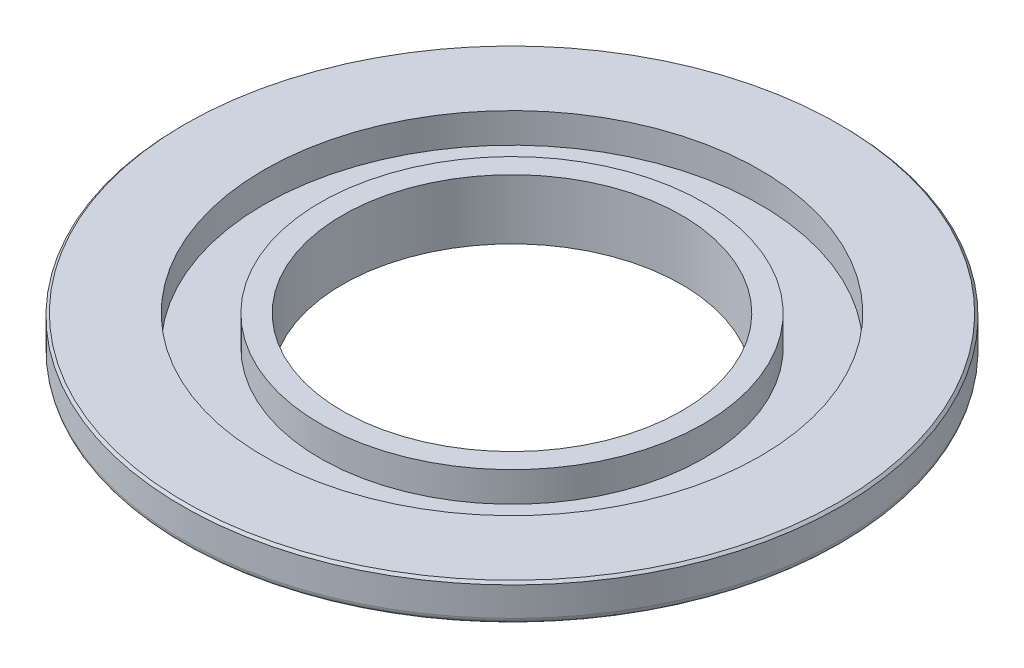
ISO-10303-21;
HEADER;
FILE_DESCRIPTION(('STEP AP214'),'2;1');
FILE_NAME('part.step','',(''),(''),'','','');
FILE_SCHEMA(('AUTOMOTIVE_DESIGN { 1 0 10303 214 1 1 1 1 }'));
ENDSEC;
DATA;
#1=APPLICATION_CONTEXT('core data for automotive mechanical design processes');
#2=APPLICATION_PROTOCOL_DEFINITION('international standard','automotive_design',2000,#1);
#3=PRODUCT_CONTEXT('',#1,'mechanical');
#4=PRODUCT('Part','Part','',(#3));
#5=PRODUCT_RELATED_PRODUCT_CATEGORY('part','',(#4));
#6=PRODUCT_DEFINITION_FORMATION('','',#4);
#7=PRODUCT_DEFINITION_CONTEXT('part definition',#1,'design');
#8=PRODUCT_DEFINITION('design','',#6,#7);
#9=PRODUCT_DEFINITION_SHAPE('','',#8);
#10=(LENGTH_UNIT() NAMED_UNIT(*) SI_UNIT(.MILLI.,.METRE.));
#11=(NAMED_UNIT(*) PLANE_ANGLE_UNIT() SI_UNIT($,.RADIAN.));
#12=(NAMED_UNIT(*) SI_UNIT($,.STERADIAN.) SOLID_ANGLE_UNIT());
#13=UNCERTAINTY_MEASURE_WITH_UNIT(LENGTH_MEASURE(1.E-05),#10,'distance_accuracy_value','');
#14=(GEOMETRIC_REPRESENTATION_CONTEXT(3) GLOBAL_UNCERTAINTY_ASSIGNED_CONTEXT((#13)) GLOBAL_UNIT_ASSIGNED_CONTEXT((#10,
#11,#12)) REPRESENTATION_CONTEXT('',''));
#15=CARTESIAN_POINT('',(0.,0.,0.));
#16=DIRECTION('',(0.,0.,1.));
#17=DIRECTION('',(1.,0.,0.));
#18=AXIS2_PLACEMENT_3D('',#15,#16,#17);
#19=CARTESIAN_POINT('',(0.,0.,0.));
#20=DIRECTION('',(0.,-1.,0.));
#21=DIRECTION('',(0.,0.,-1.));
#22=AXIS2_PLACEMENT_3D('',#19,#20,#21);
#23=PLANE('',#22);
#24=CARTESIAN_POINT('',(0.,0.,0.));
#25=DIRECTION('',(0.,-1.,0.));
#26=DIRECTION('',(1.,0.,0.));
#27=AXIS2_PLACEMENT_3D('',#24,#25,#26);
#28=CIRCLE('',#27,14.15);
#29=CARTESIAN_POINT('',(14.15,0.,0.));
#30=VERTEX_POINT('',#29);
#31=EDGE_CURVE('E11',#30,#30,#28,.T.);
#32=ORIENTED_EDGE('',*,*,#31,.F.);
#33=EDGE_LOOP('',(#32));
#34=FACE_BOUND('',#33,.T.);
#35=CARTESIAN_POINT('',(0.,0.,0.));
#36=DIRECTION('',(0.,1.,0.));
#37=DIRECTION('',(1.,0.,0.));
#38=AXIS2_PLACEMENT_3D('',#35,#36,#37);
#39=CIRCLE('',#38,20.04);
#40=CARTESIAN_POINT('',(-20.04,0.,0.));
#41=VERTEX_POINT('',#40);
#42=EDGE_CURVE('E94',#41,#41,#39,.T.);
#43=ORIENTED_EDGE('',*,*,#42,.F.);
#44=EDGE_LOOP('',(#43));
#45=FACE_BOUND('',#44,.T.);
#46=ADVANCED_FACE('F17',(#34,#45),#23,.T.);
#47=CARTESIAN_POINT('',(0.,5.25,0.));
#48=DIRECTION('',(0.,-1.,0.));
#49=DIRECTION('',(-1.,0.,0.));
#50=AXIS2_PLACEMENT_3D('',#47,#48,#49);
#51=CYLINDRICAL_SURFACE('',#50,14.15);
#52=CARTESIAN_POINT('',(0.,5.,0.));
#53=DIRECTION('',(0.,-1.,0.));
#54=DIRECTION('',(1.,0.,0.));
#55=AXIS2_PLACEMENT_3D('',#52,#53,#54);
#56=CIRCLE('',#55,14.15);
#57=CARTESIAN_POINT('',(14.15,5.,0.));
#58=VERTEX_POINT('',#57);
#59=EDGE_CURVE('E130',#58,#58,#56,.T.);
#60=ORIENTED_EDGE('',*,*,#59,.F.);
#61=DIRECTION('',(0.,-1.,0.));
#62=VECTOR('',#61,1.);
#63=CARTESIAN_POINT('',(14.15,5.25,0.));
#64=LINE('',#63,#62);
#65=EDGE_CURVE('E27',#58,#30,#64,.T.);
#66=ORIENTED_EDGE('',*,*,#65,.T.);
#67=ORIENTED_EDGE('',*,*,#31,.T.);
#68=ORIENTED_EDGE('',*,*,#65,.F.);
#69=EDGE_LOOP('',(#60,#66,#67,#68));
#70=FACE_BOUND('',#69,.T.);
#71=ADVANCED_FACE('F19',(#70),#51,.F.);
#72=CARTESIAN_POINT('',(0.,5.,0.));
#73=DIRECTION('',(0.,-1.,0.));
#74=DIRECTION('',(0.,0.,-1.));
#75=AXIS2_PLACEMENT_3D('',#72,#73,#74);
#76=PLANE('',#75);
#77=ORIENTED_EDGE('',*,*,#59,.T.);
#78=EDGE_LOOP('',(#77));
#79=FACE_BOUND('',#78,.T.);
#80=CARTESIAN_POINT('',(0.,5.,0.));
#81=DIRECTION('',(0.,-1.,0.));
#82=DIRECTION('',(1.,0.,0.));
#83=AXIS2_PLACEMENT_3D('',#80,#81,#82);
#84=CIRCLE('',#83,16.);
#85=CARTESIAN_POINT('',(16.,5.,0.));
#86=VERTEX_POINT('',#85);
#87=EDGE_CURVE('E124',#86,#86,#84,.T.);
#88=ORIENTED_EDGE('',*,*,#87,.F.);
#89=EDGE_LOOP('',(#88));
#90=FACE_BOUND('',#89,.T.);
#91=ADVANCED_FACE('F187',(#79,#90),#76,.F.);
#92=CARTESIAN_POINT('',(0.,5.25,0.));
#93=DIRECTION('',(0.,-1.,0.));
#94=DIRECTION('',(-1.,0.,0.));
#95=AXIS2_PLACEMENT_3D('',#92,#93,#94);
#96=CYLINDRICAL_SURFACE('',#95,16.);
#97=CARTESIAN_POINT('',(0.,2.5,0.));
#98=DIRECTION('',(0.,-1.,0.));
#99=DIRECTION('',(1.,0.,0.));
#100=AXIS2_PLACEMENT_3D('',#97,#98,#99);
#101=CIRCLE('',#100,16.);
#102=CARTESIAN_POINT('',(16.,2.5,0.));
#103=VERTEX_POINT('',#102);
#104=EDGE_CURVE('E125',#103,#103,#101,.T.);
#105=ORIENTED_EDGE('',*,*,#104,.F.);
#106=DIRECTION('',(0.,1.,0.));
#107=VECTOR('',#106,1.);
#108=CARTESIAN_POINT('',(16.,5.25,0.));
#109=LINE('',#108,#107);
#110=EDGE_CURVE('E120',#103,#86,#109,.T.);
#111=ORIENTED_EDGE('',*,*,#110,.T.);
#112=ORIENTED_EDGE('',*,*,#87,.T.);
#113=ORIENTED_EDGE('',*,*,#110,.F.);
#114=EDGE_LOOP('',(#105,#111,#112,#113));
#115=FACE_BOUND('',#114,.T.);
#116=ADVANCED_FACE('F192',(#115),#96,.T.);
#117=CARTESIAN_POINT('',(0.,2.5,0.));
#118=DIRECTION('',(0.,-1.,0.));
#119=DIRECTION('',(0.,0.,-1.));
#120=AXIS2_PLACEMENT_3D('',#117,#118,#119);
#121=PLANE('',#120);
#122=ORIENTED_EDGE('',*,*,#104,.T.);
#123=EDGE_LOOP('',(#122));
#124=FACE_BOUND('',#123,.T.);
#125=CARTESIAN_POINT('',(0.,2.5,0.));
#126=DIRECTION('',(0.,-1.,0.));
#127=DIRECTION('',(1.,0.,0.));
#128=AXIS2_PLACEMENT_3D('',#125,#126,#127);
#129=CIRCLE('',#128,20.7);
#130=CARTESIAN_POINT('',(20.7,2.5,0.));
#131=VERTEX_POINT('',#130);
#132=EDGE_CURVE('E114',#131,#131,#129,.T.);
#133=ORIENTED_EDGE('',*,*,#132,.F.);
#134=EDGE_LOOP('',(#133));
#135=FACE_BOUND('',#134,.T.);
#136=ADVANCED_FACE('F194',(#124,#135),#121,.F.);
#137=CARTESIAN_POINT('',(0.,5.25,0.));
#138=DIRECTION('',(0.,-1.,0.));
#139=DIRECTION('',(-1.,0.,0.));
#140=AXIS2_PLACEMENT_3D('',#137,#138,#139);
#141=CYLINDRICAL_SURFACE('',#140,20.7);
#142=CARTESIAN_POINT('',(0.,5.,0.));
#143=DIRECTION('',(0.,-1.,0.));
#144=DIRECTION('',(1.,0.,0.));
#145=AXIS2_PLACEMENT_3D('',#142,#143,#144);
#146=CIRCLE('',#145,20.7);
#147=CARTESIAN_POINT('',(20.7,5.,0.));
#148=VERTEX_POINT('',#147);
#149=EDGE_CURVE('E115',#148,#148,#146,.T.);
#150=ORIENTED_EDGE('',*,*,#149,.F.);
#151=DIRECTION('',(0.,-1.,0.));
#152=VECTOR('',#151,1.);
#153=CARTESIAN_POINT('',(20.7,5.25,0.));
#154=LINE('',#153,#152);
#155=EDGE_CURVE('E70',#148,#131,#154,.T.);
#156=ORIENTED_EDGE('',*,*,#155,.T.);
#157=ORIENTED_EDGE('',*,*,#132,.T.);
#158=ORIENTED_EDGE('',*,*,#155,.F.);
#159=EDGE_LOOP('',(#150,#156,#157,#158));
#160=FACE_BOUND('',#159,.T.);
#161=ADVANCED_FACE('F179',(#160),#141,.F.);
#162=CARTESIAN_POINT('',(0.,5.,0.));
#163=DIRECTION('',(0.,-1.,0.));
#164=DIRECTION('',(0.,0.,-1.));
#165=AXIS2_PLACEMENT_3D('',#162,#163,#164);
#166=PLANE('',#165);
#167=ORIENTED_EDGE('',*,*,#149,.T.);
#168=EDGE_LOOP('',(#167));
#169=FACE_BOUND('',#168,.T.);
#170=CARTESIAN_POINT('',(0.,5.,0.));
#171=DIRECTION('',(0.,-1.,0.));
#172=DIRECTION('',(1.,0.,0.));
#173=AXIS2_PLACEMENT_3D('',#170,#171,#172);
#174=CIRCLE('',#173,27.3);
#175=CARTESIAN_POINT('',(27.3,5.,0.));
#176=VERTEX_POINT('',#175);
#177=EDGE_CURVE('E81',#176,#176,#174,.T.);
#178=ORIENTED_EDGE('',*,*,#177,.F.);
#179=EDGE_LOOP('',(#178));
#180=FACE_BOUND('',#179,.T.);
#181=ADVANCED_FACE('F171',(#169,#180),#166,.F.);
#182=CARTESIAN_POINT('',(0.,4.9,0.));
#183=DIRECTION('',(0.,-1.,0.));
#184=DIRECTION('',(-1.,0.,0.));
#185=AXIS2_PLACEMENT_3D('',#182,#183,#184);
#186=CONICAL_SURFACE('',#185,27.4,0.785398163397448);
#187=CARTESIAN_POINT('',(0.,4.8,0.));
#188=DIRECTION('',(0.,-1.,0.));
#189=DIRECTION('',(1.,0.,0.));
#190=AXIS2_PLACEMENT_3D('',#187,#188,#189);
#191=CIRCLE('',#190,27.5);
#192=CARTESIAN_POINT('',(27.5,4.8,0.));
#193=VERTEX_POINT('',#192);
#194=EDGE_CURVE('E129',#193,#193,#191,.T.);
#195=ORIENTED_EDGE('',*,*,#194,.F.);
#196=DIRECTION('',(-0.707106781186548,0.707106781186548,0.));
#197=VECTOR('',#196,1.);
#198=CARTESIAN_POINT('',(27.4,4.9,0.));
#199=LINE('',#198,#197);
#200=EDGE_CURVE('E126',#193,#176,#199,.T.);
#201=ORIENTED_EDGE('',*,*,#200,.T.);
#202=ORIENTED_EDGE('',*,*,#177,.T.);
#203=ORIENTED_EDGE('',*,*,#200,.F.);
#204=EDGE_LOOP('',(#195,#201,#202,#203));
#205=FACE_BOUND('',#204,.T.);
#206=ADVANCED_FACE('F169',(#205),#186,.T.);
#207=CARTESIAN_POINT('',(0.,5.25,0.));
#208=DIRECTION('',(0.,-1.,0.));
#209=DIRECTION('',(-1.,0.,0.));
#210=AXIS2_PLACEMENT_3D('',#207,#208,#209);
#211=CYLINDRICAL_SURFACE('',#210,27.5);
#212=CARTESIAN_POINT('',(0.,2.382564469526,0.));
#213=DIRECTION('',(0.,-1.,0.));
#214=DIRECTION('',(1.,0.,0.));
#215=AXIS2_PLACEMENT_3D('',#212,#213,#214);
#216=CIRCLE('',#215,27.5);
#217=CARTESIAN_POINT('',(27.5,2.382564469526,0.));
#218=VERTEX_POINT('',#217);
#219=EDGE_CURVE('E119',#218,#218,#216,.T.);
#220=ORIENTED_EDGE('',*,*,#219,.F.);
#221=DIRECTION('',(0.,1.,0.));
#222=VECTOR('',#221,1.);
#223=CARTESIAN_POINT('',(27.5,5.25,0.));
#224=LINE('',#223,#222);
#225=EDGE_CURVE('E137',#218,#193,#224,.T.);
#226=ORIENTED_EDGE('',*,*,#225,.T.);
#227=ORIENTED_EDGE('',*,*,#194,.T.);
#228=ORIENTED_EDGE('',*,*,#225,.F.);
#229=EDGE_LOOP('',(#220,#226,#227,#228));
#230=FACE_BOUND('',#229,.T.);
#231=ADVANCED_FACE('F168',(#230),#211,.T.);
#232=CARTESIAN_POINT('',(0.,2.382564469526,0.));
#233=DIRECTION('',(0.,-1.,0.));
#234=DIRECTION('',(-1.,0.,0.));
#235=AXIS2_PLACEMENT_3D('',#232,#233,#234);
#236=TOROIDAL_SURFACE('',#235,27.,0.5);
#237=CARTESIAN_POINT('',(0.,1.899601556381,0.));
#238=DIRECTION('',(0.,-1.,0.));
#239=DIRECTION('',(1.,0.,0.));
#240=AXIS2_PLACEMENT_3D('',#237,#238,#239);
#241=CIRCLE('',#240,27.12940952255);
#242=CARTESIAN_POINT('',(-27.12940952255,1.899601556381,0.));
#243=VERTEX_POINT('',#242);
#244=CARTESIAN_POINT('',(27.12940952255,1.899601556381,0.));
#245=VERTEX_POINT('',#244);
#246=EDGE_CURVE('E92',#243,#245,#241,.T.);
#247=ORIENTED_EDGE('',*,*,#246,.F.);
#248=CARTESIAN_POINT('',(0.,1.899601556381,0.));
#249=DIRECTION('',(0.,-1.,0.));
#250=DIRECTION('',(1.,0.,0.));
#251=AXIS2_PLACEMENT_3D('',#248,#249,#250);
#252=CIRCLE('',#251,27.12940952255);
#253=EDGE_CURVE('E96',#245,#243,#252,.T.);
#254=ORIENTED_EDGE('',*,*,#253,.F.);
#255=CARTESIAN_POINT('',(27.,2.382564469526,0.));
#256=DIRECTION('',(0.,0.,1.));
#257=DIRECTION('',(1.,0.,0.));
#258=AXIS2_PLACEMENT_3D('',#255,#256,#257);
#259=CIRCLE('',#258,0.5);
#260=EDGE_CURVE('E105',#245,#218,#259,.T.);
#261=ORIENTED_EDGE('',*,*,#260,.T.);
#262=ORIENTED_EDGE('',*,*,#219,.T.);
#263=ORIENTED_EDGE('',*,*,#260,.F.);
#264=EDGE_LOOP('',(#247,#254,#261,#262,#263));
#265=FACE_BOUND('',#264,.T.);
#266=ADVANCED_FACE('F103',(#265),#236,.T.);
#267=CARTESIAN_POINT('',(0.,0.9498007781906,0.));
#268=DIRECTION('',(0.,1.,0.));
#269=DIRECTION('',(1.,0.,0.));
#270=AXIS2_PLACEMENT_3D('',#267,#268,#269);
#271=CONICAL_SURFACE('',#270,23.58470476128,1.30899693899575);
#272=ORIENTED_EDGE('',*,*,#246,.T.);
#273=ORIENTED_EDGE('',*,*,#253,.T.);
#274=DIRECTION('',(0.965925826289068,-0.258819045102521,0.));
#275=VECTOR('',#274,1.);
#276=CARTESIAN_POINT('',(-23.58470476128,0.9498007781906,0.));
#277=LINE('',#276,#275);
#278=EDGE_CURVE('E88',#243,#41,#277,.T.);
#279=ORIENTED_EDGE('',*,*,#278,.T.);
#280=ORIENTED_EDGE('',*,*,#42,.T.);
#281=ORIENTED_EDGE('',*,*,#278,.F.);
#282=EDGE_LOOP('',(#272,#273,#279,#280,#281));
#283=FACE_BOUND('',#282,.T.);
#284=ADVANCED_FACE('F90',(#283),#271,.T.);
#285=CLOSED_SHELL('',(#46,#71,#91,#116,#136,#161,#181,#206,#231,#266,#284));
#286=MANIFOLD_SOLID_BREP('B1',#285);
#287=ADVANCED_BREP_SHAPE_REPRESENTATION('',(#18,#286),#14);
#288=SHAPE_DEFINITION_REPRESENTATION(#9,#287);
ENDSEC;
END-ISO-10303-21;
